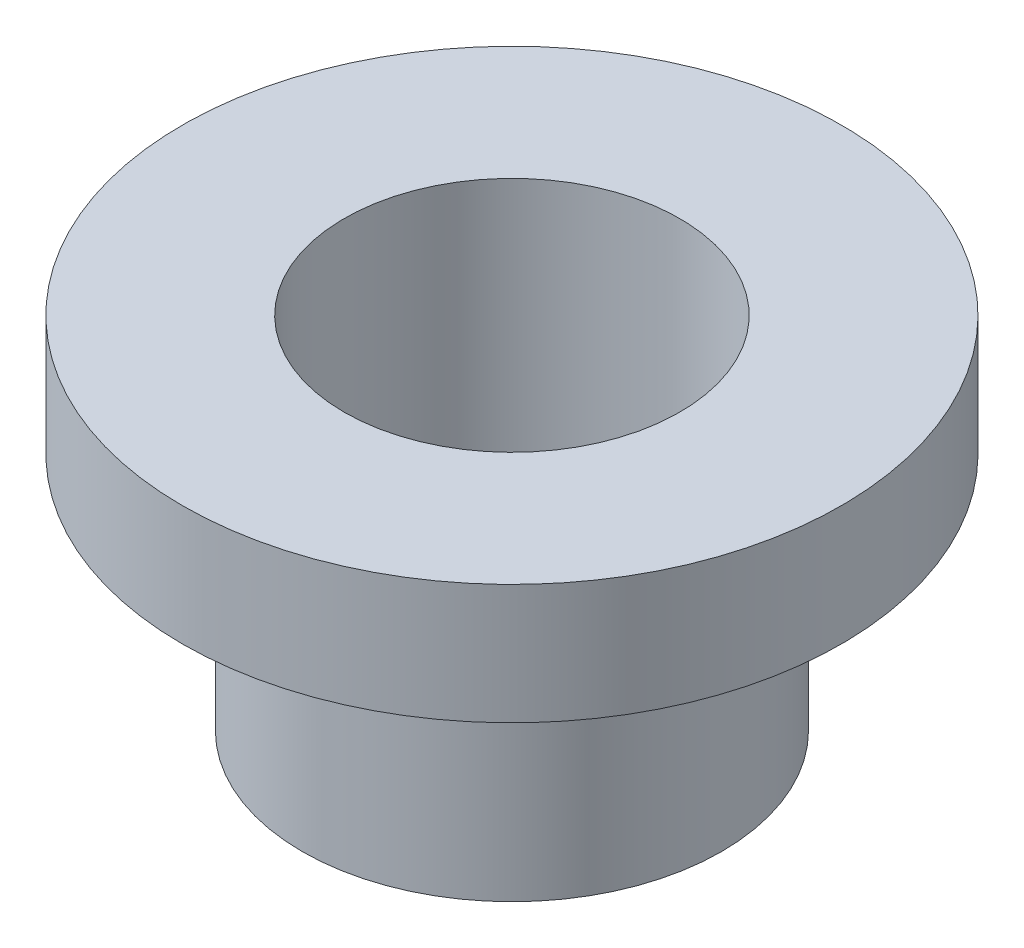
ISO-10303-21;
HEADER;
FILE_DESCRIPTION(('STEP AP214'),'2;1');
FILE_NAME('part.step','',(''),(''),'','','');
FILE_SCHEMA(('AUTOMOTIVE_DESIGN { 1 0 10303 214 1 1 1 1 }'));
ENDSEC;
DATA;
#1=APPLICATION_CONTEXT('core data for automotive mechanical design processes');
#2=APPLICATION_PROTOCOL_DEFINITION('international standard','automotive_design',2000,#1);
#3=PRODUCT_CONTEXT('',#1,'mechanical');
#4=PRODUCT('Part','Part','',(#3));
#5=PRODUCT_RELATED_PRODUCT_CATEGORY('part','',(#4));
#6=PRODUCT_DEFINITION_FORMATION('','',#4);
#7=PRODUCT_DEFINITION_CONTEXT('part definition',#1,'design');
#8=PRODUCT_DEFINITION('design','',#6,#7);
#9=PRODUCT_DEFINITION_SHAPE('','',#8);
#10=(LENGTH_UNIT() NAMED_UNIT(*) SI_UNIT(.MILLI.,.METRE.));
#11=(NAMED_UNIT(*) PLANE_ANGLE_UNIT() SI_UNIT($,.RADIAN.));
#12=(NAMED_UNIT(*) SI_UNIT($,.STERADIAN.) SOLID_ANGLE_UNIT());
#13=UNCERTAINTY_MEASURE_WITH_UNIT(LENGTH_MEASURE(1.E-05),#10,'distance_accuracy_value','');
#14=(GEOMETRIC_REPRESENTATION_CONTEXT(3) GLOBAL_UNCERTAINTY_ASSIGNED_CONTEXT((#13)) GLOBAL_UNIT_ASSIGNED_CONTEXT((#10,
#11,#12)) REPRESENTATION_CONTEXT('',''));
#15=CARTESIAN_POINT('',(0.,0.,0.));
#16=DIRECTION('',(0.,0.,1.));
#17=DIRECTION('',(1.,0.,0.));
#18=AXIS2_PLACEMENT_3D('',#15,#16,#17);
#19=CARTESIAN_POINT('',(0.,3.,0.));
#20=DIRECTION('',(0.,-1.,0.));
#21=DIRECTION('',(0.,0.,-1.));
#22=AXIS2_PLACEMENT_3D('',#19,#20,#21);
#23=CYLINDRICAL_SURFACE('',#22,1.75);
#24=CARTESIAN_POINT('',(0.,0.,0.));
#25=DIRECTION('',(0.,1.,0.));
#26=DIRECTION('',(0.,0.,1.));
#27=AXIS2_PLACEMENT_3D('',#24,#25,#26);
#28=CIRCLE('',#27,1.75);
#29=CARTESIAN_POINT('',(0.,0.,1.75));
#30=VERTEX_POINT('',#29);
#31=EDGE_CURVE('E50',#30,#30,#28,.T.);
#32=ORIENTED_EDGE('',*,*,#31,.T.);
#33=EDGE_LOOP('',(#32));
#34=FACE_BOUND('',#33,.T.);
#35=CARTESIAN_POINT('',(0.,2.,0.));
#36=DIRECTION('',(0.,1.,0.));
#37=DIRECTION('',(0.,0.,1.));
#38=AXIS2_PLACEMENT_3D('',#35,#36,#37);
#39=CIRCLE('',#38,1.75);
#40=CARTESIAN_POINT('',(0.,2.,1.75));
#41=VERTEX_POINT('',#40);
#42=EDGE_CURVE('E10',#41,#41,#39,.T.);
#43=ORIENTED_EDGE('',*,*,#42,.F.);
#44=EDGE_LOOP('',(#43));
#45=FACE_BOUND('',#44,.T.);
#46=ADVANCED_FACE('F43',(#34,#45),#23,.T.);
#47=CARTESIAN_POINT('',(0.,3.,0.));
#48=DIRECTION('',(0.,1.,0.));
#49=DIRECTION('',(0.,0.,1.));
#50=AXIS2_PLACEMENT_3D('',#47,#48,#49);
#51=PLANE('',#50);
#52=CARTESIAN_POINT('',(0.,3.,0.));
#53=DIRECTION('',(0.,1.,0.));
#54=DIRECTION('',(0.,0.,1.));
#55=AXIS2_PLACEMENT_3D('',#52,#53,#54);
#56=CIRCLE('',#55,1.4);
#57=CARTESIAN_POINT('',(0.,3.,1.4));
#58=VERTEX_POINT('',#57);
#59=EDGE_CURVE('E55',#58,#58,#56,.T.);
#60=ORIENTED_EDGE('',*,*,#59,.F.);
#61=EDGE_LOOP('',(#60));
#62=FACE_BOUND('',#61,.T.);
#63=CARTESIAN_POINT('',(0.,3.,0.));
#64=DIRECTION('',(0.,1.,0.));
#65=DIRECTION('',(0.,0.,1.));
#66=AXIS2_PLACEMENT_3D('',#63,#64,#65);
#67=CIRCLE('',#66,2.75);
#68=CARTESIAN_POINT('',(0.,3.,2.75));
#69=VERTEX_POINT('',#68);
#70=EDGE_CURVE('E67',#69,#69,#67,.T.);
#71=ORIENTED_EDGE('',*,*,#70,.T.);
#72=EDGE_LOOP('',(#71));
#73=FACE_BOUND('',#72,.T.);
#74=ADVANCED_FACE('F87',(#62,#73),#51,.T.);
#75=CARTESIAN_POINT('',(0.,0.,0.));
#76=DIRECTION('',(0.,1.,0.));
#77=DIRECTION('',(0.,0.,1.));
#78=AXIS2_PLACEMENT_3D('',#75,#76,#77);
#79=PLANE('',#78);
#80=ORIENTED_EDGE('',*,*,#31,.F.);
#81=EDGE_LOOP('',(#80));
#82=FACE_BOUND('',#81,.T.);
#83=CARTESIAN_POINT('',(0.,0.,0.));
#84=DIRECTION('',(0.,1.,0.));
#85=DIRECTION('',(0.,0.,1.));
#86=AXIS2_PLACEMENT_3D('',#83,#84,#85);
#87=CIRCLE('',#86,1.4);
#88=CARTESIAN_POINT('',(0.,0.,1.4));
#89=VERTEX_POINT('',#88);
#90=EDGE_CURVE('E60',#89,#89,#87,.T.);
#91=ORIENTED_EDGE('',*,*,#90,.T.);
#92=EDGE_LOOP('',(#91));
#93=FACE_BOUND('',#92,.T.);
#94=ADVANCED_FACE('F92',(#82,#93),#79,.F.);
#95=CARTESIAN_POINT('',(0.,3.,0.));
#96=DIRECTION('',(0.,-1.,0.));
#97=DIRECTION('',(0.,0.,-1.));
#98=AXIS2_PLACEMENT_3D('',#95,#96,#97);
#99=CYLINDRICAL_SURFACE('',#98,1.4);
#100=ORIENTED_EDGE('',*,*,#59,.T.);
#101=EDGE_LOOP('',(#100));
#102=FACE_BOUND('',#101,.T.);
#103=ORIENTED_EDGE('',*,*,#90,.F.);
#104=EDGE_LOOP('',(#103));
#105=FACE_BOUND('',#104,.T.);
#106=ADVANCED_FACE('F84',(#102,#105),#99,.F.);
#107=CARTESIAN_POINT('',(0.,2.,0.));
#108=DIRECTION('',(0.,1.,0.));
#109=DIRECTION('',(0.,0.,1.));
#110=AXIS2_PLACEMENT_3D('',#107,#108,#109);
#111=CYLINDRICAL_SURFACE('',#110,2.75);
#112=CARTESIAN_POINT('',(0.,2.,0.));
#113=DIRECTION('',(0.,1.,0.));
#114=DIRECTION('',(0.,0.,1.));
#115=AXIS2_PLACEMENT_3D('',#112,#113,#114);
#116=CIRCLE('',#115,2.75);
#117=CARTESIAN_POINT('',(0.,2.,2.75));
#118=VERTEX_POINT('',#117);
#119=EDGE_CURVE('E65',#118,#118,#116,.T.);
#120=ORIENTED_EDGE('',*,*,#119,.T.);
#121=EDGE_LOOP('',(#120));
#122=FACE_BOUND('',#121,.T.);
#123=ORIENTED_EDGE('',*,*,#70,.F.);
#124=EDGE_LOOP('',(#123));
#125=FACE_BOUND('',#124,.T.);
#126=ADVANCED_FACE('F75',(#122,#125),#111,.T.);
#127=CARTESIAN_POINT('',(0.,2.,0.));
#128=DIRECTION('',(0.,1.,0.));
#129=DIRECTION('',(0.,0.,1.));
#130=AXIS2_PLACEMENT_3D('',#127,#128,#129);
#131=PLANE('',#130);
#132=ORIENTED_EDGE('',*,*,#42,.T.);
#133=EDGE_LOOP('',(#132));
#134=FACE_BOUND('',#133,.T.);
#135=ORIENTED_EDGE('',*,*,#119,.F.);
#136=EDGE_LOOP('',(#135));
#137=FACE_BOUND('',#136,.T.);
#138=ADVANCED_FACE('F78',(#134,#137),#131,.F.);
#139=CLOSED_SHELL('',(#46,#74,#94,#106,#126,#138));
#140=MANIFOLD_SOLID_BREP('B2',#139);
#141=ADVANCED_BREP_SHAPE_REPRESENTATION('',(#18,#140),#14);
#142=SHAPE_DEFINITION_REPRESENTATION(#9,#141);
ENDSEC;
END-ISO-10303-21;
